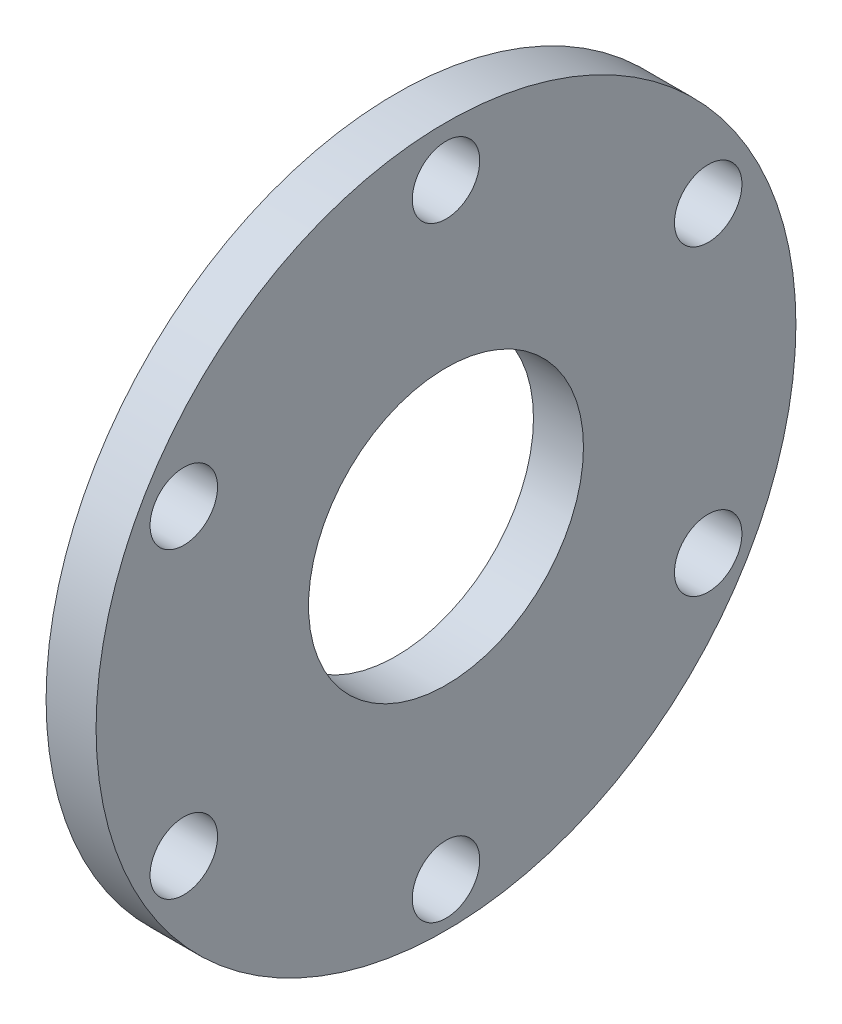
ISO-10303-21;
HEADER;
FILE_DESCRIPTION(('STEP AP214'),'2;1');
FILE_NAME('part.step','',(''),(''),'','','');
FILE_SCHEMA(('AUTOMOTIVE_DESIGN { 1 0 10303 214 1 1 1 1 }'));
ENDSEC;
DATA;
#1=APPLICATION_CONTEXT('core data for automotive mechanical design processes');
#2=APPLICATION_PROTOCOL_DEFINITION('international standard','automotive_design',2000,#1);
#3=PRODUCT_CONTEXT('',#1,'mechanical');
#4=PRODUCT('Part','Part','',(#3));
#5=PRODUCT_RELATED_PRODUCT_CATEGORY('part','',(#4));
#6=PRODUCT_DEFINITION_FORMATION('','',#4);
#7=PRODUCT_DEFINITION_CONTEXT('part definition',#1,'design');
#8=PRODUCT_DEFINITION('design','',#6,#7);
#9=PRODUCT_DEFINITION_SHAPE('','',#8);
#10=(LENGTH_UNIT() NAMED_UNIT(*) SI_UNIT(.MILLI.,.METRE.));
#11=(NAMED_UNIT(*) PLANE_ANGLE_UNIT() SI_UNIT($,.RADIAN.));
#12=(NAMED_UNIT(*) SI_UNIT($,.STERADIAN.) SOLID_ANGLE_UNIT());
#13=UNCERTAINTY_MEASURE_WITH_UNIT(LENGTH_MEASURE(1.E-05),#10,'distance_accuracy_value','');
#14=(GEOMETRIC_REPRESENTATION_CONTEXT(3) GLOBAL_UNCERTAINTY_ASSIGNED_CONTEXT((#13)) GLOBAL_UNIT_ASSIGNED_CONTEXT((#10,
#11,#12)) REPRESENTATION_CONTEXT('',''));
#15=CARTESIAN_POINT('',(0.,0.,0.));
#16=DIRECTION('',(0.,0.,1.));
#17=DIRECTION('',(1.,0.,0.));
#18=AXIS2_PLACEMENT_3D('',#15,#16,#17);
#19=CARTESIAN_POINT('',(10.,0.,0.));
#20=DIRECTION('',(-1.,0.,0.));
#21=DIRECTION('',(0.,0.,1.));
#22=AXIS2_PLACEMENT_3D('',#19,#20,#21);
#23=CYLINDRICAL_SURFACE('',#22,70.);
#24=CARTESIAN_POINT('',(10.,0.,0.));
#25=DIRECTION('',(1.,0.,0.));
#26=DIRECTION('',(0.,0.,-1.));
#27=AXIS2_PLACEMENT_3D('',#24,#25,#26);
#28=CIRCLE('',#27,70.);
#29=CARTESIAN_POINT('',(10.,0.,-70.));
#30=VERTEX_POINT('',#29);
#31=EDGE_CURVE('E12',#30,#30,#28,.T.);
#32=ORIENTED_EDGE('',*,*,#31,.F.);
#33=EDGE_LOOP('',(#32));
#34=FACE_BOUND('',#33,.T.);
#35=CARTESIAN_POINT('',(0.,0.,0.));
#36=DIRECTION('',(1.,0.,0.));
#37=DIRECTION('',(0.,0.,-1.));
#38=AXIS2_PLACEMENT_3D('',#35,#36,#37);
#39=CIRCLE('',#38,70.);
#40=CARTESIAN_POINT('',(0.,0.,-70.));
#41=VERTEX_POINT('',#40);
#42=EDGE_CURVE('E50',#41,#41,#39,.T.);
#43=ORIENTED_EDGE('',*,*,#42,.T.);
#44=EDGE_LOOP('',(#43));
#45=FACE_BOUND('',#44,.T.);
#46=ADVANCED_FACE('F43',(#34,#45),#23,.T.);
#47=CARTESIAN_POINT('',(10.,0.,0.));
#48=DIRECTION('',(1.,0.,0.));
#49=DIRECTION('',(0.,0.,-1.));
#50=AXIS2_PLACEMENT_3D('',#47,#48,#49);
#51=PLANE('',#50);
#52=CARTESIAN_POINT('',(10.,0.,0.));
#53=DIRECTION('',(1.,0.,0.));
#54=DIRECTION('',(0.,0.,-1.));
#55=AXIS2_PLACEMENT_3D('',#52,#53,#54);
#56=CIRCLE('',#55,27.5);
#57=CARTESIAN_POINT('',(10.,0.,-27.5));
#58=VERTEX_POINT('',#57);
#59=EDGE_CURVE('E94',#58,#58,#56,.T.);
#60=ORIENTED_EDGE('',*,*,#59,.F.);
#61=EDGE_LOOP('',(#60));
#62=FACE_BOUND('',#61,.T.);
#63=CARTESIAN_POINT('',(10.,29.718427727209,-52.4492217095437));
#64=DIRECTION('',(1.,0.,0.));
#65=DIRECTION('',(0.,0.,-1.));
#66=AXIS2_PLACEMENT_3D('',#63,#64,#65);
#67=CIRCLE('',#66,6.74999999999998);
#68=CARTESIAN_POINT('',(10.,29.718427727209,-59.1992217095437));
#69=VERTEX_POINT('',#68);
#70=EDGE_CURVE('E90',#69,#69,#67,.T.);
#71=ORIENTED_EDGE('',*,*,#70,.F.);
#72=EDGE_LOOP('',(#71));
#73=FACE_BOUND('',#72,.T.);
#74=CARTESIAN_POINT('',(10.,-30.8447168183744,-52.4492217095444));
#75=DIRECTION('',(1.,0.,0.));
#76=DIRECTION('',(0.,0.,-1.));
#77=AXIS2_PLACEMENT_3D('',#74,#75,#76);
#78=CIRCLE('',#77,6.74999999999999);
#79=CARTESIAN_POINT('',(10.,-30.8447168183744,-59.1992217095444));
#80=VERTEX_POINT('',#79);
#81=EDGE_CURVE('E84',#80,#80,#78,.T.);
#82=ORIENTED_EDGE('',*,*,#81,.F.);
#83=EDGE_LOOP('',(#82));
#84=FACE_BOUND('',#83,.T.);
#85=CARTESIAN_POINT('',(10.,-61.1262890911666,0.));
#86=DIRECTION('',(1.,0.,0.));
#87=DIRECTION('',(0.,0.,-1.));
#88=AXIS2_PLACEMENT_3D('',#85,#86,#87);
#89=CIRCLE('',#88,6.74999999999998);
#90=CARTESIAN_POINT('',(10.,-61.1262890911666,-6.75000000000001));
#91=VERTEX_POINT('',#90);
#92=EDGE_CURVE('E78',#91,#91,#89,.T.);
#93=ORIENTED_EDGE('',*,*,#92,.F.);
#94=EDGE_LOOP('',(#93));
#95=FACE_BOUND('',#94,.T.);
#96=CARTESIAN_POINT('',(10.,-30.8447168183752,52.4492217095439));
#97=DIRECTION('',(1.,0.,0.));
#98=DIRECTION('',(0.,0.,-1.));
#99=AXIS2_PLACEMENT_3D('',#96,#97,#98);
#100=CIRCLE('',#99,6.74999999999999);
#101=CARTESIAN_POINT('',(10.,-30.8447168183752,45.6992217095439));
#102=VERTEX_POINT('',#101);
#103=EDGE_CURVE('E71',#102,#102,#100,.T.);
#104=ORIENTED_EDGE('',*,*,#103,.F.);
#105=EDGE_LOOP('',(#104));
#106=FACE_BOUND('',#105,.T.);
#107=CARTESIAN_POINT('',(10.,29.7184277272082,52.4492217095442));
#108=DIRECTION('',(1.,0.,0.));
#109=DIRECTION('',(0.,0.,-1.));
#110=AXIS2_PLACEMENT_3D('',#107,#108,#109);
#111=CIRCLE('',#110,6.74999999999999);
#112=CARTESIAN_POINT('',(10.,29.7184277272082,45.6992217095442));
#113=VERTEX_POINT('',#112);
#114=EDGE_CURVE('E62',#113,#113,#111,.T.);
#115=ORIENTED_EDGE('',*,*,#114,.F.);
#116=EDGE_LOOP('',(#115));
#117=FACE_BOUND('',#116,.T.);
#118=CARTESIAN_POINT('',(10.,60.,0.));
#119=DIRECTION('',(1.,0.,0.));
#120=DIRECTION('',(0.,0.,-1.));
#121=AXIS2_PLACEMENT_3D('',#118,#119,#120);
#122=CIRCLE('',#121,6.74999999999999);
#123=CARTESIAN_POINT('',(10.,60.,-6.74999999999999));
#124=VERTEX_POINT('',#123);
#125=EDGE_CURVE('E61',#124,#124,#122,.T.);
#126=ORIENTED_EDGE('',*,*,#125,.F.);
#127=EDGE_LOOP('',(#126));
#128=FACE_BOUND('',#127,.T.);
#129=ORIENTED_EDGE('',*,*,#31,.T.);
#130=EDGE_LOOP('',(#129));
#131=FACE_BOUND('',#130,.T.);
#132=ADVANCED_FACE('F110',(#62,#73,#84,#95,#106,#117,#128,#131),#51,.T.);
#133=CARTESIAN_POINT('',(0.,0.,0.));
#134=DIRECTION('',(1.,0.,0.));
#135=DIRECTION('',(0.,0.,-1.));
#136=AXIS2_PLACEMENT_3D('',#133,#134,#135);
#137=PLANE('',#136);
#138=CARTESIAN_POINT('',(0.,0.,0.));
#139=DIRECTION('',(1.,0.,0.));
#140=DIRECTION('',(0.,0.,-1.));
#141=AXIS2_PLACEMENT_3D('',#138,#139,#140);
#142=CIRCLE('',#141,27.5);
#143=CARTESIAN_POINT('',(0.,0.,-27.5));
#144=VERTEX_POINT('',#143);
#145=EDGE_CURVE('E93',#144,#144,#142,.T.);
#146=ORIENTED_EDGE('',*,*,#145,.T.);
#147=EDGE_LOOP('',(#146));
#148=FACE_BOUND('',#147,.T.);
#149=CARTESIAN_POINT('',(0.,29.718427727209,-52.4492217095437));
#150=DIRECTION('',(1.,0.,0.));
#151=DIRECTION('',(0.,0.,-1.));
#152=AXIS2_PLACEMENT_3D('',#149,#150,#151);
#153=CIRCLE('',#152,6.74999999999998);
#154=CARTESIAN_POINT('',(0.,29.718427727209,-59.1992217095437));
#155=VERTEX_POINT('',#154);
#156=EDGE_CURVE('E87',#155,#155,#153,.T.);
#157=ORIENTED_EDGE('',*,*,#156,.T.);
#158=EDGE_LOOP('',(#157));
#159=FACE_BOUND('',#158,.T.);
#160=CARTESIAN_POINT('',(0.,-30.8447168183744,-52.4492217095444));
#161=DIRECTION('',(1.,0.,0.));
#162=DIRECTION('',(0.,0.,-1.));
#163=AXIS2_PLACEMENT_3D('',#160,#161,#162);
#164=CIRCLE('',#163,6.74999999999998);
#165=CARTESIAN_POINT('',(0.,-30.8447168183744,-59.1992217095444));
#166=VERTEX_POINT('',#165);
#167=EDGE_CURVE('E81',#166,#166,#164,.T.);
#168=ORIENTED_EDGE('',*,*,#167,.T.);
#169=EDGE_LOOP('',(#168));
#170=FACE_BOUND('',#169,.T.);
#171=CARTESIAN_POINT('',(0.,-61.1262890911666,0.));
#172=DIRECTION('',(1.,0.,0.));
#173=DIRECTION('',(0.,0.,-1.));
#174=AXIS2_PLACEMENT_3D('',#171,#172,#173);
#175=CIRCLE('',#174,6.74999999999998);
#176=CARTESIAN_POINT('',(0.,-61.1262890911666,-6.75000000000001));
#177=VERTEX_POINT('',#176);
#178=EDGE_CURVE('E75',#177,#177,#175,.T.);
#179=ORIENTED_EDGE('',*,*,#178,.T.);
#180=EDGE_LOOP('',(#179));
#181=FACE_BOUND('',#180,.T.);
#182=CARTESIAN_POINT('',(0.,-30.8447168183752,52.4492217095439));
#183=DIRECTION('',(1.,0.,0.));
#184=DIRECTION('',(0.,0.,-1.));
#185=AXIS2_PLACEMENT_3D('',#182,#183,#184);
#186=CIRCLE('',#185,6.74999999999998);
#187=CARTESIAN_POINT('',(0.,-30.8447168183752,45.699221709544));
#188=VERTEX_POINT('',#187);
#189=EDGE_CURVE('E46',#188,#188,#186,.T.);
#190=ORIENTED_EDGE('',*,*,#189,.T.);
#191=EDGE_LOOP('',(#190));
#192=FACE_BOUND('',#191,.T.);
#193=CARTESIAN_POINT('',(0.,29.7184277272082,52.4492217095442));
#194=DIRECTION('',(1.,0.,0.));
#195=DIRECTION('',(0.,0.,-1.));
#196=AXIS2_PLACEMENT_3D('',#193,#194,#195);
#197=CIRCLE('',#196,6.74999999999998);
#198=CARTESIAN_POINT('',(0.,29.7184277272082,45.6992217095442));
#199=VERTEX_POINT('',#198);
#200=EDGE_CURVE('E59',#199,#199,#197,.T.);
#201=ORIENTED_EDGE('',*,*,#200,.T.);
#202=EDGE_LOOP('',(#201));
#203=FACE_BOUND('',#202,.T.);
#204=CARTESIAN_POINT('',(0.,60.,0.));
#205=DIRECTION('',(1.,0.,0.));
#206=DIRECTION('',(0.,0.,-1.));
#207=AXIS2_PLACEMENT_3D('',#204,#205,#206);
#208=CIRCLE('',#207,6.74999999999998);
#209=CARTESIAN_POINT('',(0.,60.,-6.74999999999998));
#210=VERTEX_POINT('',#209);
#211=EDGE_CURVE('E55',#210,#210,#208,.T.);
#212=ORIENTED_EDGE('',*,*,#211,.T.);
#213=EDGE_LOOP('',(#212));
#214=FACE_BOUND('',#213,.T.);
#215=ORIENTED_EDGE('',*,*,#42,.F.);
#216=EDGE_LOOP('',(#215));
#217=FACE_BOUND('',#216,.T.);
#218=ADVANCED_FACE('F100',(#148,#159,#170,#181,#192,#203,#214,#217),#137,.F.);
#219=CARTESIAN_POINT('',(10.,60.,0.));
#220=DIRECTION('',(1.,0.,0.));
#221=DIRECTION('',(0.,0.,-1.));
#222=AXIS2_PLACEMENT_3D('',#219,#220,#221);
#223=CYLINDRICAL_SURFACE('',#222,6.74999999999998);
#224=ORIENTED_EDGE('',*,*,#125,.T.);
#225=EDGE_LOOP('',(#224));
#226=FACE_BOUND('',#225,.T.);
#227=ORIENTED_EDGE('',*,*,#211,.F.);
#228=EDGE_LOOP('',(#227));
#229=FACE_BOUND('',#228,.T.);
#230=ADVANCED_FACE('F125',(#226,#229),#223,.F.);
#231=CARTESIAN_POINT('',(10.,29.7184277272082,52.4492217095442));
#232=DIRECTION('',(1.,0.,0.));
#233=DIRECTION('',(0.,0.,-1.));
#234=AXIS2_PLACEMENT_3D('',#231,#232,#233);
#235=CYLINDRICAL_SURFACE('',#234,6.74999999999998);
#236=ORIENTED_EDGE('',*,*,#114,.T.);
#237=EDGE_LOOP('',(#236));
#238=FACE_BOUND('',#237,.T.);
#239=ORIENTED_EDGE('',*,*,#200,.F.);
#240=EDGE_LOOP('',(#239));
#241=FACE_BOUND('',#240,.T.);
#242=ADVANCED_FACE('F128',(#238,#241),#235,.F.);
#243=CARTESIAN_POINT('',(10.,-30.8447168183752,52.4492217095439));
#244=DIRECTION('',(1.,0.,0.));
#245=DIRECTION('',(0.,0.,-1.));
#246=AXIS2_PLACEMENT_3D('',#243,#244,#245);
#247=CYLINDRICAL_SURFACE('',#246,6.74999999999998);
#248=ORIENTED_EDGE('',*,*,#103,.T.);
#249=EDGE_LOOP('',(#248));
#250=FACE_BOUND('',#249,.T.);
#251=ORIENTED_EDGE('',*,*,#189,.F.);
#252=EDGE_LOOP('',(#251));
#253=FACE_BOUND('',#252,.T.);
#254=ADVANCED_FACE('F161',(#250,#253),#247,.F.);
#255=CARTESIAN_POINT('',(10.,-61.1262890911666,0.));
#256=DIRECTION('',(1.,0.,0.));
#257=DIRECTION('',(0.,0.,-1.));
#258=AXIS2_PLACEMENT_3D('',#255,#256,#257);
#259=CYLINDRICAL_SURFACE('',#258,6.74999999999998);
#260=ORIENTED_EDGE('',*,*,#92,.T.);
#261=EDGE_LOOP('',(#260));
#262=FACE_BOUND('',#261,.T.);
#263=ORIENTED_EDGE('',*,*,#178,.F.);
#264=EDGE_LOOP('',(#263));
#265=FACE_BOUND('',#264,.T.);
#266=ADVANCED_FACE('F168',(#262,#265),#259,.F.);
#267=CARTESIAN_POINT('',(10.,-30.8447168183744,-52.4492217095444));
#268=DIRECTION('',(1.,0.,0.));
#269=DIRECTION('',(0.,0.,-1.));
#270=AXIS2_PLACEMENT_3D('',#267,#268,#269);
#271=CYLINDRICAL_SURFACE('',#270,6.74999999999998);
#272=ORIENTED_EDGE('',*,*,#81,.T.);
#273=EDGE_LOOP('',(#272));
#274=FACE_BOUND('',#273,.T.);
#275=ORIENTED_EDGE('',*,*,#167,.F.);
#276=EDGE_LOOP('',(#275));
#277=FACE_BOUND('',#276,.T.);
#278=ADVANCED_FACE('F176',(#274,#277),#271,.F.);
#279=CARTESIAN_POINT('',(10.,29.718427727209,-52.4492217095437));
#280=DIRECTION('',(1.,0.,0.));
#281=DIRECTION('',(0.,0.,-1.));
#282=AXIS2_PLACEMENT_3D('',#279,#280,#281);
#283=CYLINDRICAL_SURFACE('',#282,6.74999999999998);
#284=ORIENTED_EDGE('',*,*,#70,.T.);
#285=EDGE_LOOP('',(#284));
#286=FACE_BOUND('',#285,.T.);
#287=ORIENTED_EDGE('',*,*,#156,.F.);
#288=EDGE_LOOP('',(#287));
#289=FACE_BOUND('',#288,.T.);
#290=ADVANCED_FACE('F106',(#286,#289),#283,.F.);
#291=CARTESIAN_POINT('',(0.,0.,0.));
#292=DIRECTION('',(1.,0.,0.));
#293=DIRECTION('',(0.,0.,-1.));
#294=AXIS2_PLACEMENT_3D('',#291,#292,#293);
#295=CYLINDRICAL_SURFACE('',#294,27.5);
#296=ORIENTED_EDGE('',*,*,#145,.F.);
#297=EDGE_LOOP('',(#296));
#298=FACE_BOUND('',#297,.T.);
#299=ORIENTED_EDGE('',*,*,#59,.T.);
#300=EDGE_LOOP('',(#299));
#301=FACE_BOUND('',#300,.T.);
#302=ADVANCED_FACE('F103',(#298,#301),#295,.F.);
#303=CLOSED_SHELL('',(#46,#132,#218,#230,#242,#254,#266,#278,#290,#302));
#304=MANIFOLD_SOLID_BREP('B2',#303);
#305=ADVANCED_BREP_SHAPE_REPRESENTATION('',(#18,#304),#14);
#306=SHAPE_DEFINITION_REPRESENTATION(#9,#305);
ENDSEC;
END-ISO-10303-21;
